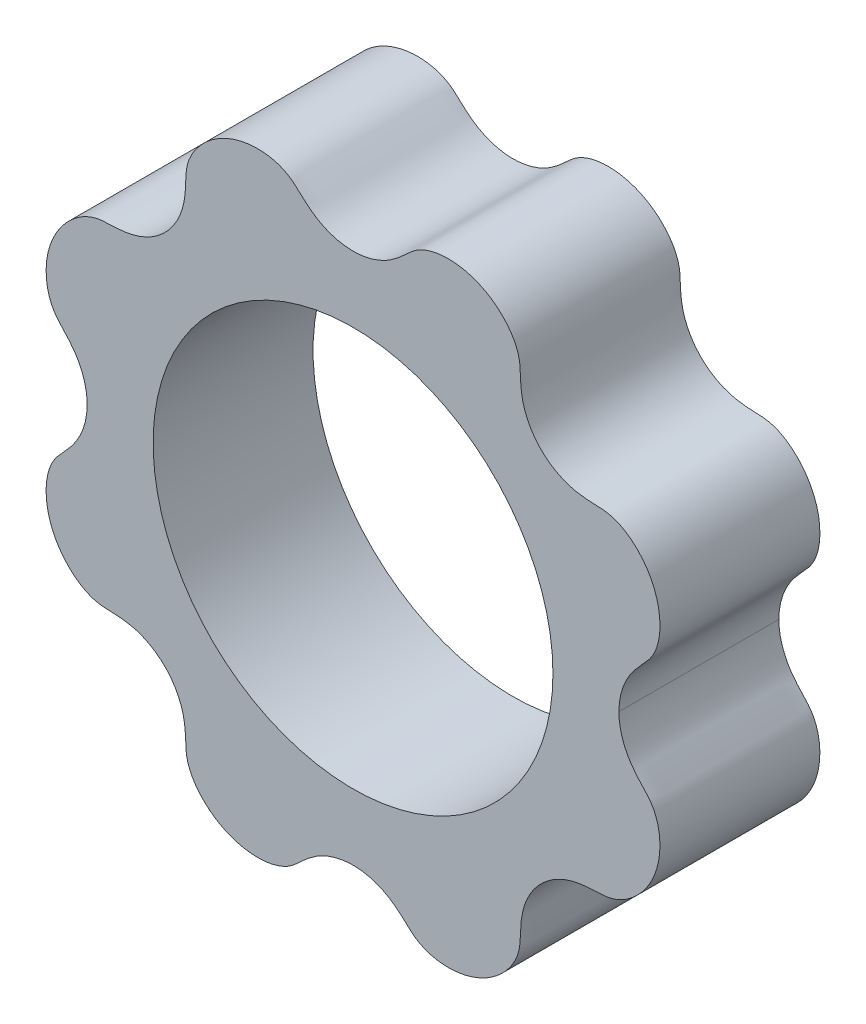
ISO-10303-21;
HEADER;
FILE_DESCRIPTION(('STEP AP214'),'2;1');
FILE_NAME('part.step','',(''),(''),'','','');
FILE_SCHEMA(('AUTOMOTIVE_DESIGN { 1 0 10303 214 1 1 1 1 }'));
ENDSEC;
DATA;
#1=APPLICATION_CONTEXT('core data for automotive mechanical design processes');
#2=APPLICATION_PROTOCOL_DEFINITION('international standard','automotive_design',2000,#1);
#3=PRODUCT_CONTEXT('',#1,'mechanical');
#4=PRODUCT('Part','Part','',(#3));
#5=PRODUCT_RELATED_PRODUCT_CATEGORY('part','',(#4));
#6=PRODUCT_DEFINITION_FORMATION('','',#4);
#7=PRODUCT_DEFINITION_CONTEXT('part definition',#1,'design');
#8=PRODUCT_DEFINITION('design','',#6,#7);
#9=PRODUCT_DEFINITION_SHAPE('','',#8);
#10=(LENGTH_UNIT() NAMED_UNIT(*) SI_UNIT(.MILLI.,.METRE.));
#11=(NAMED_UNIT(*) PLANE_ANGLE_UNIT() SI_UNIT($,.RADIAN.));
#12=(NAMED_UNIT(*) SI_UNIT($,.STERADIAN.) SOLID_ANGLE_UNIT());
#13=UNCERTAINTY_MEASURE_WITH_UNIT(LENGTH_MEASURE(1.E-05),#10,'distance_accuracy_value','');
#14=(GEOMETRIC_REPRESENTATION_CONTEXT(3) GLOBAL_UNCERTAINTY_ASSIGNED_CONTEXT((#13)) GLOBAL_UNIT_ASSIGNED_CONTEXT((#10,
#11,#12)) REPRESENTATION_CONTEXT('',''));
#15=CARTESIAN_POINT('',(0.,0.,0.));
#16=DIRECTION('',(0.,0.,1.));
#17=DIRECTION('',(1.,0.,0.));
#18=AXIS2_PLACEMENT_3D('',#15,#16,#17);
#19=CARTESIAN_POINT('',(-2.24239481396902E-05,-6.6500124910714,4.));
#20=DIRECTION('',(0.,0.,1.));
#21=DIRECTION('',(1.,0.,0.));
#22=AXIS2_PLACEMENT_3D('',#19,#20,#21);
#23=PLANE('',#22);
#24=CARTESIAN_POINT('',(-6.65,-1.25035158366323E-13,4.));
#25=CARTESIAN_POINT('',(-6.65000000000038,-0.302657352481258,4.));
#26=CARTESIAN_POINT('',(-6.77619122847717,-0.765289107568745,4.));
#27=CARTESIAN_POINT('',(-7.16163562460477,-1.25013217888991,4.));
#28=CARTESIAN_POINT('',(-7.55978252941742,-1.6351090156131,4.));
#29=CARTESIAN_POINT('',(-7.73509804907509,-2.31392412995038,4.));
#30=CARTESIAN_POINT('',(-7.58423551935104,-3.14147001219009,4.));
#31=CARTESIAN_POINT('',(-7.10559740712993,-3.83362804515998,4.));
#32=CARTESIAN_POINT('',(-6.50197178900577,-4.18916160270117,4.));
#33=CARTESIAN_POINT('',(-5.94821623808744,-4.18066911741087,4.));
#34=CARTESIAN_POINT('',(-5.33185372406875,-4.25055760526156,4.));
#35=CARTESIAN_POINT('',(-4.64287892153853,-4.64290538567212,4.));
#36=CARTESIAN_POINT('',(-4.25081749850075,-5.33213424722259,4.));
#37=CARTESIAN_POINT('',(-4.18001848907951,-5.94807792336402,4.));
#38=CARTESIAN_POINT('',(-4.18939727507366,-6.50168716434199,4.));
#39=CARTESIAN_POINT('',(-3.83335836038563,-7.10576802842934,4.));
#40=CARTESIAN_POINT('',(-3.1414662905571,-7.58417961939213,4.));
#41=CARTESIAN_POINT('',(-2.31394837147991,-7.73524008321944,4.));
#42=CARTESIAN_POINT('',(-1.63485729975444,-7.55948184932252,4.));
#43=CARTESIAN_POINT('',(-1.25025039435467,-7.16179967740772,4.));
#44=CARTESIAN_POINT('',(-0.764591661355972,-6.77610473160974,4.));
#45=CARTESIAN_POINT('',(-6.99797869341506E-05,-6.56601609582495,4.));
#46=CARTESIAN_POINT('',(0.764689480976076,-6.7759094362724,4.));
#47=CARTESIAN_POINT('',(1.24982638478904,-7.16198811181102,4.));
#48=CARTESIAN_POINT('',(1.63522061399097,-7.55980315336619,4.));
#49=CARTESIAN_POINT('',(2.31373423752019,-7.73516717948474,4.));
#50=CARTESIAN_POINT('',(3.14148893478402,-7.58418653693072,4.));
#51=CARTESIAN_POINT('',(3.83341698062433,-7.10585474606948,4.));
#52=CARTESIAN_POINT('',(4.18934096750948,-6.50137239964691,4.));
#53=CARTESIAN_POINT('',(4.18010076070597,-5.94821390052344,4.));
#54=CARTESIAN_POINT('',(4.2507739045539,-5.33207069829091,4.));
#55=CARTESIAN_POINT('',(4.64288324328693,-4.64294272436903,4.));
#56=CARTESIAN_POINT('',(5.33185825591799,-4.25054514806044,4.));
#57=CARTESIAN_POINT('',(5.948209907454,-4.18067322480948,4.));
#58=CARTESIAN_POINT('',(6.50197372716594,-4.18916041449052,4.));
#59=CARTESIAN_POINT('',(7.10560231599911,-3.83363340805859,4.));
#60=CARTESIAN_POINT('',(7.58421293977971,-3.14145030728361,4.));
#61=CARTESIAN_POINT('',(7.7351969389915,-2.31397174227754,4.));
#62=CARTESIAN_POINT('',(7.55953418557688,-1.63488191829621,4.));
#63=CARTESIAN_POINT('',(7.16182085309456,-1.25013632091767,4.));
#64=CARTESIAN_POINT('',(6.77610981188082,-0.765324140132753,4.));
#65=CARTESIAN_POINT('',(6.6499999999954,-0.302665812636224,4.));
#66=CARTESIAN_POINT('',(6.65,1.51965807817771E-12,4.));
#67=B_SPLINE_CURVE_WITH_KNOTS('',3,(#24,#25,#26,#27,#28,#29,#30,#31,#32,#33,#34,#35,#36,#37,#38,
#39,#40,#41,#42,#43,#44,#45,#46,#47,#48,#49,#50,#51,#52,#53,#54,#55,#56,#57,#58,#59,#60,#61,#62,
#63,#64,#65,#66),.UNSPECIFIED.,.F.,.F.,(4,1,1,1,1,1,1,1,1,1,1,1,1,1,1,1,1,1,1,1,1,1,1,1,1,1,1,1,
1,1,1,1,1,1,1,1,1,1,1,1,4),(0.0657796024565335,0.0929183773030002,0.106487764726234,
0.120057152149467,0.147195926995934,0.1743347018424,0.201473476688867,0.228612251535333,
0.242181638958567,0.2557510263818,0.282889801228267,0.310028576074733,0.323597963497967,
0.3371673509212,0.364306125767667,0.391444900614134,0.4185836754606,0.445722450307067,
0.4592918377303,0.472861225153534,0.5,0.527138774846467,0.5407081622697,0.554277549692934,
0.5814163245394,0.608555099385867,0.635693874232334,0.6628326490788,0.676402036502034,
0.689971423925267,0.717110198771734,0.7442489736182,0.757818361041434,0.771387748464667,
0.798526523311134,0.8256652981576,0.852804073004067,0.879942847850534,0.893512235273767,
0.907081622697,0.934220397543467),.UNSPECIFIED.);
#68=CARTESIAN_POINT('',(-6.65,2.53276346434347E-13,4.));
#69=VERTEX_POINT('',#68);
#70=CARTESIAN_POINT('',(6.64999999999999,-3.04572821489822E-12,4.));
#71=VERTEX_POINT('',#70);
#72=EDGE_CURVE('E65',#69,#71,#67,.T.);
#73=ORIENTED_EDGE('',*,*,#72,.T.);
#74=CARTESIAN_POINT('',(6.64999999999999,-3.04572821489822E-12,4.));
#75=CARTESIAN_POINT('',(6.64999999999077,0.30266581264056,4.));
#76=CARTESIAN_POINT('',(6.77610981188082,0.765324140152404,4.));
#77=CARTESIAN_POINT('',(7.16182085309282,1.2501363209345,4.));
#78=CARTESIAN_POINT('',(7.55953418557494,1.63488191831435,4.));
#79=CARTESIAN_POINT('',(7.73519693898858,2.3139717422955,4.));
#80=CARTESIAN_POINT('',(7.58421293977581,3.14145030730152,4.));
#81=CARTESIAN_POINT('',(7.10560231599433,3.83363340807586,4.));
#82=CARTESIAN_POINT('',(6.50197372716072,4.18916041450704,4.));
#83=CARTESIAN_POINT('',(5.94820990744879,4.18067322482532,4.));
#84=CARTESIAN_POINT('',(5.33185825591269,4.25054514807551,4.));
#85=CARTESIAN_POINT('',(4.64288324328114,4.64294272438324,4.));
#86=CARTESIAN_POINT('',(4.25077390454725,5.33207069830463,4.));
#87=CARTESIAN_POINT('',(4.18010076069855,5.94821390053707,4.));
#88=CARTESIAN_POINT('',(4.18934096750137,6.50137239966055,4.));
#89=CARTESIAN_POINT('',(3.83341698061547,7.10585474608268,4.));
#90=CARTESIAN_POINT('',(3.14148893477455,7.58418653694305,4.));
#91=CARTESIAN_POINT('',(2.31373423751054,7.73516717949604,4.));
#92=CARTESIAN_POINT('',(1.63522061398154,7.55980315337664,4.));
#93=CARTESIAN_POINT('',(1.24982638478011,7.16198811182099,4.));
#94=CARTESIAN_POINT('',(0.764689480967626,6.77590943628177,4.));
#95=CARTESIAN_POINT('',(-6.9979795123997E-05,6.56601609583336,4.));
#96=CARTESIAN_POINT('',(-0.764591661364423,6.77610473161721,4.));
#97=CARTESIAN_POINT('',(-1.2502503943636,7.16179967741457,4.));
#98=CARTESIAN_POINT('',(-1.63485729976387,7.5594818493289,4.));
#99=CARTESIAN_POINT('',(-2.31394837148956,7.73524008322497,4.));
#100=CARTESIAN_POINT('',(-3.14146629056656,7.58417961939663,4.));
#101=CARTESIAN_POINT('',(-3.83335836039449,7.10576802843298,4.));
#102=CARTESIAN_POINT('',(-4.18939727508177,6.50168716434518,4.));
#103=CARTESIAN_POINT('',(-4.18001848908693,5.94807792336722,4.));
#104=CARTESIAN_POINT('',(-4.2508174985074,5.33213424722571,4.));
#105=CARTESIAN_POINT('',(-4.64287892154433,4.64290538567474,4.));
#106=CARTESIAN_POINT('',(-5.33185372407405,4.25055760526333,4.));
#107=CARTESIAN_POINT('',(-5.94821623809265,4.18066911741187,4.));
#108=CARTESIAN_POINT('',(-6.501971789011,4.18916160270148,4.));
#109=CARTESIAN_POINT('',(-7.10559740713471,3.83362804515954,4.));
#110=CARTESIAN_POINT('',(-7.58423551935496,3.14147001218905,4.));
#111=CARTESIAN_POINT('',(-7.73509804907798,2.31392412994915,4.));
#112=CARTESIAN_POINT('',(-7.55978252941945,1.63510901561209,4.));
#113=CARTESIAN_POINT('',(-7.16163562460634,1.2501321788894,4.));
#114=CARTESIAN_POINT('',(-6.77619122847812,0.765289107568711,4.));
#115=CARTESIAN_POINT('',(-6.65000000000077,0.302657352481385,4.));
#116=CARTESIAN_POINT('',(-6.65,2.53276346434347E-13,4.));
#117=B_SPLINE_CURVE_WITH_KNOTS('',3,(#74,#75,#76,#77,#78,#79,#80,#81,#82,#83,#84,#85,#86,#87,
#88,#89,#90,#91,#92,#93,#94,#95,#96,#97,#98,#99,#100,#101,#102,#103,#104,#105,#106,#107,#108,
#109,#110,#111,#112,#113,#114,#115,#116),.UNSPECIFIED.,.F.,.F.,(4,1,1,1,1,1,1,1,1,1,1,1,1,1,1,1,
1,1,1,1,1,1,1,1,1,1,1,1,1,1,1,1,1,1,1,1,1,1,1,1,4),(0.0657796024565335,0.0929183773030002,
0.106487764726234,0.120057152149467,0.147195926995934,0.1743347018424,0.201473476688867,
0.228612251535334,0.242181638958567,0.2557510263818,0.282889801228267,0.310028576074734,
0.323597963497967,0.3371673509212,0.364306125767667,0.391444900614134,0.4185836754606,
0.445722450307067,0.4592918377303,0.472861225153534,0.5,0.527138774846467,0.5407081622697,
0.554277549692934,0.5814163245394,0.608555099385867,0.635693874232334,0.6628326490788,
0.676402036502034,0.689971423925267,0.717110198771734,0.7442489736182,0.757818361041434,
0.771387748464667,0.798526523311134,0.8256652981576,0.852804073004067,0.879942847850534,
0.893512235273767,0.907081622697,0.934220397543467),.UNSPECIFIED.);
#118=EDGE_CURVE('E50',#71,#69,#117,.T.);
#119=ORIENTED_EDGE('',*,*,#118,.T.);
#120=EDGE_LOOP('',(#73,#119));
#121=FACE_BOUND('',#120,.T.);
#122=CARTESIAN_POINT('',(0.,0.,4.));
#123=DIRECTION('',(0.,0.,1.));
#124=DIRECTION('',(1.,0.,0.));
#125=AXIS2_PLACEMENT_3D('',#122,#123,#124);
#126=CIRCLE('',#125,5.);
#127=CARTESIAN_POINT('',(5.,0.,4.));
#128=VERTEX_POINT('',#127);
#129=EDGE_CURVE('E71',#128,#128,#126,.T.);
#130=ORIENTED_EDGE('',*,*,#129,.F.);
#131=EDGE_LOOP('',(#130));
#132=FACE_BOUND('',#131,.T.);
#133=ADVANCED_FACE('F33',(#121,#132),#23,.T.);
#134=CARTESIAN_POINT('',(-2.24239481396902E-05,-6.6500124910714,0.));
#135=DIRECTION('',(0.,0.,1.));
#136=DIRECTION('',(1.,0.,0.));
#137=AXIS2_PLACEMENT_3D('',#134,#135,#136);
#138=PLANE('',#137);
#139=CARTESIAN_POINT('',(-6.65,-1.25035158366323E-13,0.));
#140=CARTESIAN_POINT('',(-6.65000000000038,-0.302657352481258,0.));
#141=CARTESIAN_POINT('',(-6.77619122847717,-0.765289107568745,0.));
#142=CARTESIAN_POINT('',(-7.16163562460477,-1.25013217888991,0.));
#143=CARTESIAN_POINT('',(-7.55978252941742,-1.6351090156131,0.));
#144=CARTESIAN_POINT('',(-7.73509804907509,-2.31392412995038,0.));
#145=CARTESIAN_POINT('',(-7.58423551935104,-3.14147001219009,0.));
#146=CARTESIAN_POINT('',(-7.10559740712993,-3.83362804515998,0.));
#147=CARTESIAN_POINT('',(-6.50197178900577,-4.18916160270117,0.));
#148=CARTESIAN_POINT('',(-5.94821623808744,-4.18066911741087,0.));
#149=CARTESIAN_POINT('',(-5.33185372406875,-4.25055760526156,0.));
#150=CARTESIAN_POINT('',(-4.64287892153853,-4.64290538567212,0.));
#151=CARTESIAN_POINT('',(-4.25081749850075,-5.33213424722259,0.));
#152=CARTESIAN_POINT('',(-4.18001848907951,-5.94807792336402,0.));
#153=CARTESIAN_POINT('',(-4.18939727507366,-6.50168716434199,0.));
#154=CARTESIAN_POINT('',(-3.83335836038563,-7.10576802842934,0.));
#155=CARTESIAN_POINT('',(-3.1414662905571,-7.58417961939213,0.));
#156=CARTESIAN_POINT('',(-2.31394837147991,-7.73524008321944,0.));
#157=CARTESIAN_POINT('',(-1.63485729975444,-7.55948184932252,0.));
#158=CARTESIAN_POINT('',(-1.25025039435467,-7.16179967740772,0.));
#159=CARTESIAN_POINT('',(-0.764591661355972,-6.77610473160974,0.));
#160=CARTESIAN_POINT('',(-6.99797869341506E-05,-6.56601609582495,0.));
#161=CARTESIAN_POINT('',(0.764689480976076,-6.7759094362724,0.));
#162=CARTESIAN_POINT('',(1.24982638478904,-7.16198811181102,0.));
#163=CARTESIAN_POINT('',(1.63522061399097,-7.55980315336619,0.));
#164=CARTESIAN_POINT('',(2.31373423752019,-7.73516717948474,0.));
#165=CARTESIAN_POINT('',(3.14148893478402,-7.58418653693072,0.));
#166=CARTESIAN_POINT('',(3.83341698062433,-7.10585474606948,0.));
#167=CARTESIAN_POINT('',(4.18934096750948,-6.50137239964691,0.));
#168=CARTESIAN_POINT('',(4.18010076070597,-5.94821390052344,0.));
#169=CARTESIAN_POINT('',(4.2507739045539,-5.33207069829091,0.));
#170=CARTESIAN_POINT('',(4.64288324328693,-4.64294272436903,0.));
#171=CARTESIAN_POINT('',(5.33185825591799,-4.25054514806044,0.));
#172=CARTESIAN_POINT('',(5.948209907454,-4.18067322480948,0.));
#173=CARTESIAN_POINT('',(6.50197372716594,-4.18916041449052,0.));
#174=CARTESIAN_POINT('',(7.10560231599911,-3.83363340805859,0.));
#175=CARTESIAN_POINT('',(7.58421293977971,-3.14145030728361,0.));
#176=CARTESIAN_POINT('',(7.7351969389915,-2.31397174227754,0.));
#177=CARTESIAN_POINT('',(7.55953418557688,-1.63488191829621,0.));
#178=CARTESIAN_POINT('',(7.16182085309456,-1.25013632091767,0.));
#179=CARTESIAN_POINT('',(6.77610981188082,-0.765324140132753,0.));
#180=CARTESIAN_POINT('',(6.6499999999954,-0.302665812636224,0.));
#181=CARTESIAN_POINT('',(6.65,1.51965807817771E-12,0.));
#182=B_SPLINE_CURVE_WITH_KNOTS('',3,(#139,#140,#141,#142,#143,#144,#145,#146,#147,#148,#149,
#150,#151,#152,#153,#154,#155,#156,#157,#158,#159,#160,#161,#162,#163,#164,#165,#166,#167,#168,
#169,#170,#171,#172,#173,#174,#175,#176,#177,#178,#179,#180,#181),.UNSPECIFIED.,.F.,.F.,(4,1,1,
1,1,1,1,1,1,1,1,1,1,1,1,1,1,1,1,1,1,1,1,1,1,1,1,1,1,1,1,1,1,1,1,1,1,1,1,1,4),
(0.0657796024565335,0.0929183773030002,0.106487764726234,0.120057152149467,0.147195926995934,
0.1743347018424,0.201473476688867,0.228612251535333,0.242181638958567,0.2557510263818,
0.282889801228267,0.310028576074733,0.323597963497967,0.3371673509212,0.364306125767667,
0.391444900614134,0.4185836754606,0.445722450307067,0.4592918377303,0.472861225153534,0.5,
0.527138774846467,0.5407081622697,0.554277549692934,0.5814163245394,0.608555099385867,
0.635693874232334,0.6628326490788,0.676402036502034,0.689971423925267,0.717110198771734,
0.7442489736182,0.757818361041434,0.771387748464667,0.798526523311134,0.8256652981576,
0.852804073004067,0.879942847850534,0.893512235273767,0.907081622697,0.934220397543467),.UNSPECIFIED.);
#183=CARTESIAN_POINT('',(-6.65,2.53276346434347E-13,0.));
#184=VERTEX_POINT('',#183);
#185=CARTESIAN_POINT('',(6.64999999999999,-3.04572821489822E-12,0.));
#186=VERTEX_POINT('',#185);
#187=EDGE_CURVE('E66',#184,#186,#182,.T.);
#188=ORIENTED_EDGE('',*,*,#187,.F.);
#189=CARTESIAN_POINT('',(6.64999999999999,-3.04572821489822E-12,0.));
#190=CARTESIAN_POINT('',(6.64999999999077,0.30266581264056,0.));
#191=CARTESIAN_POINT('',(6.77610981188082,0.765324140152404,0.));
#192=CARTESIAN_POINT('',(7.16182085309282,1.2501363209345,0.));
#193=CARTESIAN_POINT('',(7.55953418557494,1.63488191831435,0.));
#194=CARTESIAN_POINT('',(7.73519693898858,2.3139717422955,0.));
#195=CARTESIAN_POINT('',(7.58421293977581,3.14145030730152,0.));
#196=CARTESIAN_POINT('',(7.10560231599433,3.83363340807586,0.));
#197=CARTESIAN_POINT('',(6.50197372716072,4.18916041450704,0.));
#198=CARTESIAN_POINT('',(5.94820990744879,4.18067322482532,0.));
#199=CARTESIAN_POINT('',(5.33185825591269,4.25054514807551,0.));
#200=CARTESIAN_POINT('',(4.64288324328114,4.64294272438324,0.));
#201=CARTESIAN_POINT('',(4.25077390454725,5.33207069830463,0.));
#202=CARTESIAN_POINT('',(4.18010076069855,5.94821390053707,0.));
#203=CARTESIAN_POINT('',(4.18934096750137,6.50137239966055,0.));
#204=CARTESIAN_POINT('',(3.83341698061547,7.10585474608268,0.));
#205=CARTESIAN_POINT('',(3.14148893477455,7.58418653694305,0.));
#206=CARTESIAN_POINT('',(2.31373423751054,7.73516717949604,0.));
#207=CARTESIAN_POINT('',(1.63522061398154,7.55980315337664,0.));
#208=CARTESIAN_POINT('',(1.24982638478011,7.16198811182099,0.));
#209=CARTESIAN_POINT('',(0.764689480967626,6.77590943628177,0.));
#210=CARTESIAN_POINT('',(-6.9979795123997E-05,6.56601609583336,0.));
#211=CARTESIAN_POINT('',(-0.764591661364423,6.77610473161721,0.));
#212=CARTESIAN_POINT('',(-1.2502503943636,7.16179967741457,0.));
#213=CARTESIAN_POINT('',(-1.63485729976387,7.5594818493289,0.));
#214=CARTESIAN_POINT('',(-2.31394837148956,7.73524008322497,0.));
#215=CARTESIAN_POINT('',(-3.14146629056656,7.58417961939663,0.));
#216=CARTESIAN_POINT('',(-3.83335836039449,7.10576802843298,0.));
#217=CARTESIAN_POINT('',(-4.18939727508177,6.50168716434518,0.));
#218=CARTESIAN_POINT('',(-4.18001848908693,5.94807792336722,0.));
#219=CARTESIAN_POINT('',(-4.2508174985074,5.33213424722571,0.));
#220=CARTESIAN_POINT('',(-4.64287892154433,4.64290538567474,0.));
#221=CARTESIAN_POINT('',(-5.33185372407405,4.25055760526333,0.));
#222=CARTESIAN_POINT('',(-5.94821623809265,4.18066911741187,0.));
#223=CARTESIAN_POINT('',(-6.501971789011,4.18916160270148,0.));
#224=CARTESIAN_POINT('',(-7.10559740713471,3.83362804515954,0.));
#225=CARTESIAN_POINT('',(-7.58423551935496,3.14147001218905,0.));
#226=CARTESIAN_POINT('',(-7.73509804907798,2.31392412994915,0.));
#227=CARTESIAN_POINT('',(-7.55978252941945,1.63510901561209,0.));
#228=CARTESIAN_POINT('',(-7.16163562460634,1.2501321788894,0.));
#229=CARTESIAN_POINT('',(-6.77619122847812,0.765289107568711,0.));
#230=CARTESIAN_POINT('',(-6.65000000000077,0.302657352481385,0.));
#231=CARTESIAN_POINT('',(-6.65,2.53276346434347E-13,0.));
#232=B_SPLINE_CURVE_WITH_KNOTS('',3,(#189,#190,#191,#192,#193,#194,#195,#196,#197,#198,#199,
#200,#201,#202,#203,#204,#205,#206,#207,#208,#209,#210,#211,#212,#213,#214,#215,#216,#217,#218,
#219,#220,#221,#222,#223,#224,#225,#226,#227,#228,#229,#230,#231),.UNSPECIFIED.,.F.,.F.,(4,1,1,
1,1,1,1,1,1,1,1,1,1,1,1,1,1,1,1,1,1,1,1,1,1,1,1,1,1,1,1,1,1,1,1,1,1,1,1,1,4),
(0.0657796024565335,0.0929183773030002,0.106487764726234,0.120057152149467,0.147195926995934,
0.1743347018424,0.201473476688867,0.228612251535334,0.242181638958567,0.2557510263818,
0.282889801228267,0.310028576074734,0.323597963497967,0.3371673509212,0.364306125767667,
0.391444900614134,0.4185836754606,0.445722450307067,0.4592918377303,0.472861225153534,0.5,
0.527138774846467,0.5407081622697,0.554277549692934,0.5814163245394,0.608555099385867,
0.635693874232334,0.6628326490788,0.676402036502034,0.689971423925267,0.717110198771734,
0.7442489736182,0.757818361041434,0.771387748464667,0.798526523311134,0.8256652981576,
0.852804073004067,0.879942847850534,0.893512235273767,0.907081622697,0.934220397543467),.UNSPECIFIED.);
#233=EDGE_CURVE('E58',#186,#184,#232,.T.);
#234=ORIENTED_EDGE('',*,*,#233,.F.);
#235=EDGE_LOOP('',(#188,#234));
#236=FACE_BOUND('',#235,.T.);
#237=CARTESIAN_POINT('',(0.,0.,0.));
#238=DIRECTION('',(0.,0.,1.));
#239=DIRECTION('',(1.,0.,0.));
#240=AXIS2_PLACEMENT_3D('',#237,#238,#239);
#241=CIRCLE('',#240,5.);
#242=CARTESIAN_POINT('',(5.,0.,0.));
#243=VERTEX_POINT('',#242);
#244=EDGE_CURVE('E74',#243,#243,#241,.T.);
#245=ORIENTED_EDGE('',*,*,#244,.T.);
#246=EDGE_LOOP('',(#245));
#247=FACE_BOUND('',#246,.T.);
#248=ADVANCED_FACE('F69',(#236,#247),#138,.F.);
#249=DIRECTION('',(0.,0.,-1.));
#250=VECTOR('',#249,1.);
#251=SURFACE_OF_LINEAR_EXTRUSION('',#67,#250);
#252=ORIENTED_EDGE('',*,*,#187,.T.);
#253=DIRECTION('',(0.,0.,-1.));
#254=VECTOR('',#253,1.);
#255=CARTESIAN_POINT('',(6.64999999999999,-3.04572821489822E-12,4.));
#256=LINE('',#255,#254);
#257=EDGE_CURVE('E11',#71,#186,#256,.T.);
#258=ORIENTED_EDGE('',*,*,#257,.F.);
#259=ORIENTED_EDGE('',*,*,#72,.F.);
#260=DIRECTION('',(0.,0.,-1.));
#261=VECTOR('',#260,1.);
#262=CARTESIAN_POINT('',(-6.65,2.53276346434347E-13,4.));
#263=LINE('',#262,#261);
#264=EDGE_CURVE('E43',#69,#184,#263,.T.);
#265=ORIENTED_EDGE('',*,*,#264,.T.);
#266=EDGE_LOOP('',(#252,#258,#259,#265));
#267=FACE_BOUND('',#266,.T.);
#268=ADVANCED_FACE('F35',(#267),#251,.F.);
#269=DIRECTION('',(0.,0.,-1.));
#270=VECTOR('',#269,1.);
#271=SURFACE_OF_LINEAR_EXTRUSION('',#117,#270);
#272=ORIENTED_EDGE('',*,*,#233,.T.);
#273=ORIENTED_EDGE('',*,*,#264,.F.);
#274=ORIENTED_EDGE('',*,*,#118,.F.);
#275=ORIENTED_EDGE('',*,*,#257,.T.);
#276=EDGE_LOOP('',(#272,#273,#274,#275));
#277=FACE_BOUND('',#276,.T.);
#278=ADVANCED_FACE('F61',(#277),#271,.F.);
#279=CARTESIAN_POINT('',(0.,0.,4.));
#280=DIRECTION('',(0.,0.,-1.));
#281=DIRECTION('',(-1.,0.,0.));
#282=AXIS2_PLACEMENT_3D('',#279,#280,#281);
#283=CYLINDRICAL_SURFACE('',#282,5.);
#284=ORIENTED_EDGE('',*,*,#129,.T.);
#285=EDGE_LOOP('',(#284));
#286=FACE_BOUND('',#285,.T.);
#287=ORIENTED_EDGE('',*,*,#244,.F.);
#288=EDGE_LOOP('',(#287));
#289=FACE_BOUND('',#288,.T.);
#290=ADVANCED_FACE('F99',(#286,#289),#283,.F.);
#291=CLOSED_SHELL('',(#133,#248,#268,#278,#290));
#292=MANIFOLD_SOLID_BREP('B2',#291);
#293=ADVANCED_BREP_SHAPE_REPRESENTATION('',(#18,#292),#14);
#294=SHAPE_DEFINITION_REPRESENTATION(#9,#293);
ENDSEC;
END-ISO-10303-21;
